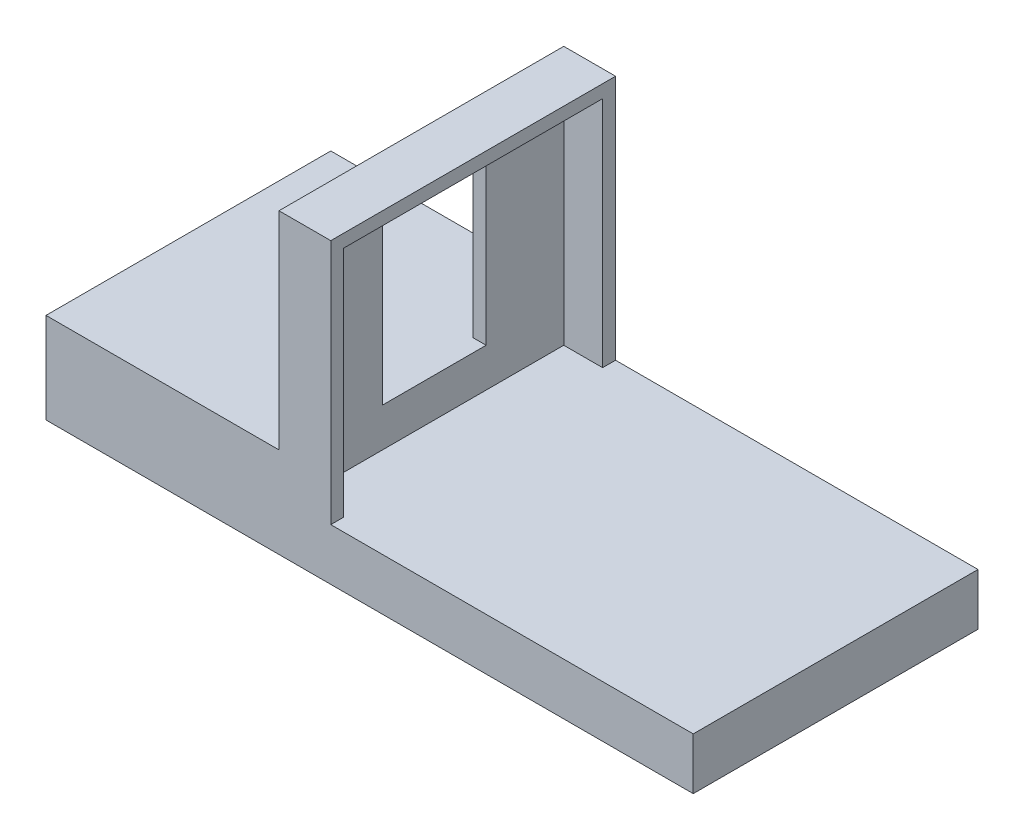
ISO-10303-21;
HEADER;
FILE_DESCRIPTION(('STEP AP214'),'2;1');
FILE_NAME('part.step','',(''),(''),'','','');
FILE_SCHEMA(('AUTOMOTIVE_DESIGN { 1 0 10303 214 1 1 1 1 }'));
ENDSEC;
DATA;
#1=APPLICATION_CONTEXT('core data for automotive mechanical design processes');
#2=APPLICATION_PROTOCOL_DEFINITION('international standard','automotive_design',2000,#1);
#3=PRODUCT_CONTEXT('',#1,'mechanical');
#4=PRODUCT('Part','Part','',(#3));
#5=PRODUCT_RELATED_PRODUCT_CATEGORY('part','',(#4));
#6=PRODUCT_DEFINITION_FORMATION('','',#4);
#7=PRODUCT_DEFINITION_CONTEXT('part definition',#1,'design');
#8=PRODUCT_DEFINITION('design','',#6,#7);
#9=PRODUCT_DEFINITION_SHAPE('','',#8);
#10=(LENGTH_UNIT() NAMED_UNIT(*) SI_UNIT(.MILLI.,.METRE.));
#11=(NAMED_UNIT(*) PLANE_ANGLE_UNIT() SI_UNIT($,.RADIAN.));
#12=(NAMED_UNIT(*) SI_UNIT($,.STERADIAN.) SOLID_ANGLE_UNIT());
#13=UNCERTAINTY_MEASURE_WITH_UNIT(LENGTH_MEASURE(1.E-05),#10,'distance_accuracy_value','');
#14=(GEOMETRIC_REPRESENTATION_CONTEXT(3) GLOBAL_UNCERTAINTY_ASSIGNED_CONTEXT((#13)) GLOBAL_UNIT_ASSIGNED_CONTEXT((#10,
#11,#12)) REPRESENTATION_CONTEXT('',''));
#15=CARTESIAN_POINT('',(0.,0.,0.));
#16=DIRECTION('',(0.,0.,1.));
#17=DIRECTION('',(1.,0.,0.));
#18=AXIS2_PLACEMENT_3D('',#15,#16,#17);
#19=CARTESIAN_POINT('',(-120.,15.,50.));
#20=DIRECTION('',(0.,0.,1.));
#21=DIRECTION('',(1.,0.,0.));
#22=AXIS2_PLACEMENT_3D('',#19,#20,#21);
#23=PLANE('',#22);
#24=DIRECTION('',(-1.,0.,0.));
#25=VECTOR('',#24,1.);
#26=CARTESIAN_POINT('',(-30.,20.,50.));
#27=LINE('',#26,#25);
#28=CARTESIAN_POINT('',(-15.,20.,50.));
#29=VERTEX_POINT('',#28);
#30=CARTESIAN_POINT('',(-30.,20.,50.));
#31=VERTEX_POINT('',#30);
#32=EDGE_CURVE('E55',#29,#31,#27,.T.);
#33=ORIENTED_EDGE('',*,*,#32,.T.);
#34=DIRECTION('',(0.,-1.,0.));
#35=VECTOR('',#34,1.);
#36=CARTESIAN_POINT('',(-30.,110.,50.));
#37=LINE('',#36,#35);
#38=CARTESIAN_POINT('',(-30.,110.,50.));
#39=VERTEX_POINT('',#38);
#40=EDGE_CURVE('E196',#39,#31,#37,.T.);
#41=ORIENTED_EDGE('',*,*,#40,.F.);
#42=DIRECTION('',(-1.,0.,0.));
#43=VECTOR('',#42,1.);
#44=CARTESIAN_POINT('',(-30.,110.,50.));
#45=LINE('',#44,#43);
#46=CARTESIAN_POINT('',(-15.,110.,50.));
#47=VERTEX_POINT('',#46);
#48=EDGE_CURVE('E197',#47,#39,#45,.T.);
#49=ORIENTED_EDGE('',*,*,#48,.F.);
#50=DIRECTION('',(0.,1.,0.));
#51=VECTOR('',#50,1.);
#52=CARTESIAN_POINT('',(-15.,35.,50.));
#53=LINE('',#52,#51);
#54=EDGE_CURVE('E11',#29,#47,#53,.T.);
#55=ORIENTED_EDGE('',*,*,#54,.F.);
#56=EDGE_LOOP('',(#33,#41,#49,#55));
#57=FACE_BOUND('',#56,.T.);
#58=ADVANCED_FACE('F39',(#57),#23,.F.);
#59=CARTESIAN_POINT('',(-120.,15.,-50.));
#60=DIRECTION('',(0.,0.,-1.));
#61=DIRECTION('',(-1.,0.,0.));
#62=AXIS2_PLACEMENT_3D('',#59,#60,#61);
#63=PLANE('',#62);
#64=DIRECTION('',(1.,0.,0.));
#65=VECTOR('',#64,1.);
#66=CARTESIAN_POINT('',(-30.,20.,-50.));
#67=LINE('',#66,#65);
#68=CARTESIAN_POINT('',(-30.,20.,-50.));
#69=VERTEX_POINT('',#68);
#70=CARTESIAN_POINT('',(-15.,20.,-50.));
#71=VERTEX_POINT('',#70);
#72=EDGE_CURVE('E212',#69,#71,#67,.T.);
#73=ORIENTED_EDGE('',*,*,#72,.T.);
#74=DIRECTION('',(0.,-1.,0.));
#75=VECTOR('',#74,1.);
#76=CARTESIAN_POINT('',(-15.,35.,-50.));
#77=LINE('',#76,#75);
#78=CARTESIAN_POINT('',(-15.,110.,-50.));
#79=VERTEX_POINT('',#78);
#80=EDGE_CURVE('E48',#79,#71,#77,.T.);
#81=ORIENTED_EDGE('',*,*,#80,.F.);
#82=DIRECTION('',(1.,0.,0.));
#83=VECTOR('',#82,1.);
#84=CARTESIAN_POINT('',(-30.,110.,-50.));
#85=LINE('',#84,#83);
#86=CARTESIAN_POINT('',(-30.,110.,-50.));
#87=VERTEX_POINT('',#86);
#88=EDGE_CURVE('E200',#87,#79,#85,.T.);
#89=ORIENTED_EDGE('',*,*,#88,.F.);
#90=DIRECTION('',(0.,-1.,0.));
#91=VECTOR('',#90,1.);
#92=CARTESIAN_POINT('',(-30.,110.,-50.));
#93=LINE('',#92,#91);
#94=EDGE_CURVE('E188',#87,#69,#93,.T.);
#95=ORIENTED_EDGE('',*,*,#94,.T.);
#96=EDGE_LOOP('',(#73,#81,#89,#95));
#97=FACE_BOUND('',#96,.T.);
#98=ADVANCED_FACE('F201',(#97),#63,.F.);
#99=CARTESIAN_POINT('',(-30.,110.,50.));
#100=DIRECTION('',(-1.,0.,0.));
#101=DIRECTION('',(0.,0.,1.));
#102=AXIS2_PLACEMENT_3D('',#99,#100,#101);
#103=PLANE('',#102);
#104=DIRECTION('',(0.,0.,1.));
#105=VECTOR('',#104,1.);
#106=CARTESIAN_POINT('',(-30.,35.,0.));
#107=LINE('',#106,#105);
#108=CARTESIAN_POINT('',(-30.,35.,-20.));
#109=VERTEX_POINT('',#108);
#110=CARTESIAN_POINT('',(-30.,35.,20.));
#111=VERTEX_POINT('',#110);
#112=EDGE_CURVE('E232',#109,#111,#107,.T.);
#113=ORIENTED_EDGE('',*,*,#112,.T.);
#114=DIRECTION('',(0.,-1.,0.));
#115=VECTOR('',#114,1.);
#116=CARTESIAN_POINT('',(-30.,100.596067403861,20.));
#117=LINE('',#116,#115);
#118=CARTESIAN_POINT('',(-30.,100.596067403861,20.));
#119=VERTEX_POINT('',#118);
#120=EDGE_CURVE('E219',#119,#111,#117,.T.);
#121=ORIENTED_EDGE('',*,*,#120,.F.);
#122=DIRECTION('',(0.,0.,1.));
#123=VECTOR('',#122,1.);
#124=CARTESIAN_POINT('',(-30.,100.596067403861,-20.));
#125=LINE('',#124,#123);
#126=CARTESIAN_POINT('',(-30.,100.596067403861,-20.));
#127=VERTEX_POINT('',#126);
#128=EDGE_CURVE('E224',#127,#119,#125,.T.);
#129=ORIENTED_EDGE('',*,*,#128,.F.);
#130=DIRECTION('',(0.,1.,0.));
#131=VECTOR('',#130,1.);
#132=CARTESIAN_POINT('',(-30.,100.596067403861,-20.));
#133=LINE('',#132,#131);
#134=EDGE_CURVE('E228',#109,#127,#133,.T.);
#135=ORIENTED_EDGE('',*,*,#134,.F.);
#136=EDGE_LOOP('',(#113,#121,#129,#135));
#137=FACE_BOUND('',#136,.T.);
#138=DIRECTION('',(0.,0.,-1.));
#139=VECTOR('',#138,1.);
#140=CARTESIAN_POINT('',(-30.,20.,50.));
#141=LINE('',#140,#139);
#142=EDGE_CURVE('E62',#31,#69,#141,.T.);
#143=ORIENTED_EDGE('',*,*,#142,.T.);
#144=ORIENTED_EDGE('',*,*,#94,.F.);
#145=DIRECTION('',(0.,0.,-1.));
#146=VECTOR('',#145,1.);
#147=CARTESIAN_POINT('',(-30.,110.,50.));
#148=LINE('',#147,#146);
#149=EDGE_CURVE('E192',#39,#87,#148,.T.);
#150=ORIENTED_EDGE('',*,*,#149,.F.);
#151=ORIENTED_EDGE('',*,*,#40,.T.);
#152=EDGE_LOOP('',(#143,#144,#150,#151));
#153=FACE_BOUND('',#152,.T.);
#154=ADVANCED_FACE('F190',(#137,#153),#103,.F.);
#155=CARTESIAN_POINT('',(0.,15.,0.));
#156=DIRECTION('',(0.,-1.,0.));
#157=DIRECTION('',(0.,0.,-1.));
#158=AXIS2_PLACEMENT_3D('',#155,#156,#157);
#159=PLANE('',#158);
#160=DIRECTION('',(-1.,0.,0.));
#161=VECTOR('',#160,1.);
#162=CARTESIAN_POINT('',(-120.,15.,50.));
#163=LINE('',#162,#161);
#164=CARTESIAN_POINT('',(120.,15.,50.));
#165=VERTEX_POINT('',#164);
#166=CARTESIAN_POINT('',(-35.,15.,50.));
#167=VERTEX_POINT('',#166);
#168=EDGE_CURVE('E269',#165,#167,#163,.T.);
#169=ORIENTED_EDGE('',*,*,#168,.T.);
#170=DIRECTION('',(0.,0.,-1.));
#171=VECTOR('',#170,1.);
#172=CARTESIAN_POINT('',(-35.,15.,50.));
#173=LINE('',#172,#171);
#174=CARTESIAN_POINT('',(-35.,15.,-50.));
#175=VERTEX_POINT('',#174);
#176=EDGE_CURVE('E235',#167,#175,#173,.T.);
#177=ORIENTED_EDGE('',*,*,#176,.T.);
#178=DIRECTION('',(1.,0.,0.));
#179=VECTOR('',#178,1.);
#180=CARTESIAN_POINT('',(-120.,15.,-50.));
#181=LINE('',#180,#179);
#182=CARTESIAN_POINT('',(120.,15.,-50.));
#183=VERTEX_POINT('',#182);
#184=EDGE_CURVE('E261',#175,#183,#181,.T.);
#185=ORIENTED_EDGE('',*,*,#184,.T.);
#186=DIRECTION('',(0.,0.,1.));
#187=VECTOR('',#186,1.);
#188=CARTESIAN_POINT('',(120.,15.,50.));
#189=LINE('',#188,#187);
#190=EDGE_CURVE('E264',#183,#165,#189,.T.);
#191=ORIENTED_EDGE('',*,*,#190,.T.);
#192=EDGE_LOOP('',(#169,#177,#185,#191));
#193=FACE_BOUND('',#192,.T.);
#194=ADVANCED_FACE('F461',(#193),#159,.T.);
#195=CARTESIAN_POINT('',(-125.,20.,-55.));
#196=DIRECTION('',(1.,0.,0.));
#197=DIRECTION('',(0.,0.,-1.));
#198=AXIS2_PLACEMENT_3D('',#195,#196,#197);
#199=PLANE('',#198);
#200=DIRECTION('',(0.,0.,1.));
#201=VECTOR('',#200,1.);
#202=CARTESIAN_POINT('',(-125.,0.,-55.));
#203=LINE('',#202,#201);
#204=CARTESIAN_POINT('',(-125.,0.,-55.));
#205=VERTEX_POINT('',#204);
#206=CARTESIAN_POINT('',(-125.,0.,55.));
#207=VERTEX_POINT('',#206);
#208=EDGE_CURVE('E373',#205,#207,#203,.T.);
#209=ORIENTED_EDGE('',*,*,#208,.T.);
#210=DIRECTION('',(0.,-1.,0.));
#211=VECTOR('',#210,1.);
#212=CARTESIAN_POINT('',(-125.,20.,55.));
#213=LINE('',#212,#211);
#214=CARTESIAN_POINT('',(-125.,35.,55.));
#215=VERTEX_POINT('',#214);
#216=EDGE_CURVE('E408',#215,#207,#213,.T.);
#217=ORIENTED_EDGE('',*,*,#216,.F.);
#218=DIRECTION('',(0.,0.,1.));
#219=VECTOR('',#218,1.);
#220=CARTESIAN_POINT('',(-125.,35.,-55.));
#221=LINE('',#220,#219);
#222=CARTESIAN_POINT('',(-125.,35.,-55.));
#223=VERTEX_POINT('',#222);
#224=EDGE_CURVE('E350',#223,#215,#221,.T.);
#225=ORIENTED_EDGE('',*,*,#224,.F.);
#226=DIRECTION('',(0.,-1.,0.));
#227=VECTOR('',#226,1.);
#228=CARTESIAN_POINT('',(-125.,20.,-55.));
#229=LINE('',#228,#227);
#230=EDGE_CURVE('E385',#223,#205,#229,.T.);
#231=ORIENTED_EDGE('',*,*,#230,.T.);
#232=EDGE_LOOP('',(#209,#217,#225,#231));
#233=FACE_BOUND('',#232,.T.);
#234=ADVANCED_FACE('F41',(#233),#199,.F.);
#235=CARTESIAN_POINT('',(-125.,20.,55.));
#236=DIRECTION('',(0.,0.,-1.));
#237=DIRECTION('',(-1.,0.,0.));
#238=AXIS2_PLACEMENT_3D('',#235,#236,#237);
#239=PLANE('',#238);
#240=DIRECTION('',(1.,0.,0.));
#241=VECTOR('',#240,1.);
#242=CARTESIAN_POINT('',(-125.,0.,55.));
#243=LINE('',#242,#241);
#244=CARTESIAN_POINT('',(125.,0.,55.));
#245=VERTEX_POINT('',#244);
#246=EDGE_CURVE('E389',#207,#245,#243,.T.);
#247=ORIENTED_EDGE('',*,*,#246,.T.);
#248=DIRECTION('',(0.,-1.,0.));
#249=VECTOR('',#248,1.);
#250=CARTESIAN_POINT('',(125.,20.,55.));
#251=LINE('',#250,#249);
#252=CARTESIAN_POINT('',(125.,20.,55.));
#253=VERTEX_POINT('',#252);
#254=EDGE_CURVE('E404',#253,#245,#251,.T.);
#255=ORIENTED_EDGE('',*,*,#254,.F.);
#256=DIRECTION('',(1.,0.,0.));
#257=VECTOR('',#256,1.);
#258=CARTESIAN_POINT('',(-125.,20.,55.));
#259=LINE('',#258,#257);
#260=CARTESIAN_POINT('',(-15.,20.,55.));
#261=VERTEX_POINT('',#260);
#262=EDGE_CURVE('E374',#261,#253,#259,.T.);
#263=ORIENTED_EDGE('',*,*,#262,.F.);
#264=DIRECTION('',(0.,-1.,0.));
#265=VECTOR('',#264,1.);
#266=CARTESIAN_POINT('',(-15.,35.,55.));
#267=LINE('',#266,#265);
#268=CARTESIAN_POINT('',(-15.,115.,55.));
#269=VERTEX_POINT('',#268);
#270=EDGE_CURVE('E369',#269,#261,#267,.T.);
#271=ORIENTED_EDGE('',*,*,#270,.F.);
#272=DIRECTION('',(1.,0.,0.));
#273=VECTOR('',#272,1.);
#274=CARTESIAN_POINT('',(-15.,115.,55.));
#275=LINE('',#274,#273);
#276=CARTESIAN_POINT('',(-35.,115.,55.));
#277=VERTEX_POINT('',#276);
#278=EDGE_CURVE('E334',#277,#269,#275,.T.);
#279=ORIENTED_EDGE('',*,*,#278,.F.);
#280=DIRECTION('',(0.,-1.,0.));
#281=VECTOR('',#280,1.);
#282=CARTESIAN_POINT('',(-35.,115.,55.));
#283=LINE('',#282,#281);
#284=CARTESIAN_POINT('',(-35.,35.,55.));
#285=VERTEX_POINT('',#284);
#286=EDGE_CURVE('E338',#277,#285,#283,.T.);
#287=ORIENTED_EDGE('',*,*,#286,.T.);
#288=DIRECTION('',(1.,0.,0.));
#289=VECTOR('',#288,1.);
#290=CARTESIAN_POINT('',(-125.,35.,55.));
#291=LINE('',#290,#289);
#292=EDGE_CURVE('E354',#215,#285,#291,.T.);
#293=ORIENTED_EDGE('',*,*,#292,.F.);
#294=ORIENTED_EDGE('',*,*,#216,.T.);
#295=EDGE_LOOP('',(#247,#255,#263,#271,#279,#287,#293,#294));
#296=FACE_BOUND('',#295,.T.);
#297=ADVANCED_FACE('F438',(#296),#239,.F.);
#298=CARTESIAN_POINT('',(125.,20.,-55.));
#299=DIRECTION('',(-1.,0.,0.));
#300=DIRECTION('',(0.,0.,1.));
#301=AXIS2_PLACEMENT_3D('',#298,#299,#300);
#302=PLANE('',#301);
#303=DIRECTION('',(0.,0.,-1.));
#304=VECTOR('',#303,1.);
#305=CARTESIAN_POINT('',(125.,0.,-55.));
#306=LINE('',#305,#304);
#307=CARTESIAN_POINT('',(125.,0.,-55.));
#308=VERTEX_POINT('',#307);
#309=EDGE_CURVE('E392',#245,#308,#306,.T.);
#310=ORIENTED_EDGE('',*,*,#309,.T.);
#311=DIRECTION('',(0.,-1.,0.));
#312=VECTOR('',#311,1.);
#313=CARTESIAN_POINT('',(125.,20.,-55.));
#314=LINE('',#313,#312);
#315=CARTESIAN_POINT('',(125.,20.,-55.));
#316=VERTEX_POINT('',#315);
#317=EDGE_CURVE('E400',#316,#308,#314,.T.);
#318=ORIENTED_EDGE('',*,*,#317,.F.);
#319=DIRECTION('',(0.,0.,-1.));
#320=VECTOR('',#319,1.);
#321=CARTESIAN_POINT('',(125.,20.,-55.));
#322=LINE('',#321,#320);
#323=EDGE_CURVE('E377',#253,#316,#322,.T.);
#324=ORIENTED_EDGE('',*,*,#323,.F.);
#325=ORIENTED_EDGE('',*,*,#254,.T.);
#326=EDGE_LOOP('',(#310,#318,#324,#325));
#327=FACE_BOUND('',#326,.T.);
#328=ADVANCED_FACE('F545',(#327),#302,.F.);
#329=CARTESIAN_POINT('',(-125.,20.,-55.));
#330=DIRECTION('',(0.,0.,1.));
#331=DIRECTION('',(1.,0.,0.));
#332=AXIS2_PLACEMENT_3D('',#329,#330,#331);
#333=PLANE('',#332);
#334=DIRECTION('',(-1.,0.,0.));
#335=VECTOR('',#334,1.);
#336=CARTESIAN_POINT('',(-125.,0.,-55.));
#337=LINE('',#336,#335);
#338=EDGE_CURVE('E378',#308,#205,#337,.T.);
#339=ORIENTED_EDGE('',*,*,#338,.T.);
#340=ORIENTED_EDGE('',*,*,#230,.F.);
#341=DIRECTION('',(-1.,0.,0.));
#342=VECTOR('',#341,1.);
#343=CARTESIAN_POINT('',(-125.,35.,-55.));
#344=LINE('',#343,#342);
#345=CARTESIAN_POINT('',(-35.,35.,-55.));
#346=VERTEX_POINT('',#345);
#347=EDGE_CURVE('E359',#346,#223,#344,.T.);
#348=ORIENTED_EDGE('',*,*,#347,.F.);
#349=DIRECTION('',(0.,-1.,0.));
#350=VECTOR('',#349,1.);
#351=CARTESIAN_POINT('',(-35.,115.,-55.));
#352=LINE('',#351,#350);
#353=CARTESIAN_POINT('',(-35.,115.,-55.));
#354=VERTEX_POINT('',#353);
#355=EDGE_CURVE('E345',#354,#346,#352,.T.);
#356=ORIENTED_EDGE('',*,*,#355,.F.);
#357=DIRECTION('',(-1.,0.,0.));
#358=VECTOR('',#357,1.);
#359=CARTESIAN_POINT('',(-15.,115.,-55.));
#360=LINE('',#359,#358);
#361=CARTESIAN_POINT('',(-15.,115.,-55.));
#362=VERTEX_POINT('',#361);
#363=EDGE_CURVE('E327',#362,#354,#360,.T.);
#364=ORIENTED_EDGE('',*,*,#363,.F.);
#365=DIRECTION('',(0.,-1.,0.));
#366=VECTOR('',#365,1.);
#367=CARTESIAN_POINT('',(-15.,35.,-55.));
#368=LINE('',#367,#366);
#369=CARTESIAN_POINT('',(-15.,20.,-55.));
#370=VERTEX_POINT('',#369);
#371=EDGE_CURVE('E362',#362,#370,#368,.T.);
#372=ORIENTED_EDGE('',*,*,#371,.T.);
#373=DIRECTION('',(-1.,0.,0.));
#374=VECTOR('',#373,1.);
#375=CARTESIAN_POINT('',(-125.,20.,-55.));
#376=LINE('',#375,#374);
#377=EDGE_CURVE('E381',#316,#370,#376,.T.);
#378=ORIENTED_EDGE('',*,*,#377,.F.);
#379=ORIENTED_EDGE('',*,*,#317,.T.);
#380=EDGE_LOOP('',(#339,#340,#348,#356,#364,#372,#378,#379));
#381=FACE_BOUND('',#380,.T.);
#382=ADVANCED_FACE('F446',(#381),#333,.F.);
#383=CARTESIAN_POINT('',(0.,20.,0.));
#384=DIRECTION('',(0.,1.,0.));
#385=DIRECTION('',(0.,0.,1.));
#386=AXIS2_PLACEMENT_3D('',#383,#384,#385);
#387=PLANE('',#386);
#388=DIRECTION('',(0.,0.,-1.));
#389=VECTOR('',#388,1.);
#390=CARTESIAN_POINT('',(-15.,20.,-55.));
#391=LINE('',#390,#389);
#392=EDGE_CURVE('E349',#71,#370,#391,.T.);
#393=ORIENTED_EDGE('',*,*,#392,.F.);
#394=ORIENTED_EDGE('',*,*,#72,.F.);
#395=ORIENTED_EDGE('',*,*,#142,.F.);
#396=ORIENTED_EDGE('',*,*,#32,.F.);
#397=EDGE_CURVE('E355',#261,#29,#391,.T.);
#398=ORIENTED_EDGE('',*,*,#397,.F.);
#399=ORIENTED_EDGE('',*,*,#262,.T.);
#400=ORIENTED_EDGE('',*,*,#323,.T.);
#401=ORIENTED_EDGE('',*,*,#377,.T.);
#402=EDGE_LOOP('',(#393,#394,#395,#396,#398,#399,#400,#401));
#403=FACE_BOUND('',#402,.T.);
#404=ADVANCED_FACE('F419',(#403),#387,.T.);
#405=CARTESIAN_POINT('',(0.,0.,0.));
#406=DIRECTION('',(0.,1.,0.));
#407=DIRECTION('',(0.,0.,1.));
#408=AXIS2_PLACEMENT_3D('',#405,#406,#407);
#409=PLANE('',#408);
#410=DIRECTION('',(1.,0.,0.));
#411=VECTOR('',#410,1.);
#412=CARTESIAN_POINT('',(-120.,0.,-50.));
#413=LINE('',#412,#411);
#414=CARTESIAN_POINT('',(-120.,0.,-50.));
#415=VERTEX_POINT('',#414);
#416=CARTESIAN_POINT('',(120.,0.,-50.));
#417=VERTEX_POINT('',#416);
#418=EDGE_CURVE('E275',#415,#417,#413,.T.);
#419=ORIENTED_EDGE('',*,*,#418,.F.);
#420=DIRECTION('',(0.,0.,-1.));
#421=VECTOR('',#420,1.);
#422=CARTESIAN_POINT('',(-120.,0.,50.));
#423=LINE('',#422,#421);
#424=CARTESIAN_POINT('',(-120.,0.,50.));
#425=VERTEX_POINT('',#424);
#426=EDGE_CURVE('E258',#425,#415,#423,.T.);
#427=ORIENTED_EDGE('',*,*,#426,.F.);
#428=DIRECTION('',(-1.,0.,0.));
#429=VECTOR('',#428,1.);
#430=CARTESIAN_POINT('',(-120.,0.,50.));
#431=LINE('',#430,#429);
#432=CARTESIAN_POINT('',(120.,0.,50.));
#433=VERTEX_POINT('',#432);
#434=EDGE_CURVE('E265',#433,#425,#431,.T.);
#435=ORIENTED_EDGE('',*,*,#434,.F.);
#436=DIRECTION('',(0.,0.,1.));
#437=VECTOR('',#436,1.);
#438=CARTESIAN_POINT('',(120.,0.,50.));
#439=LINE('',#438,#437);
#440=EDGE_CURVE('E279',#417,#433,#439,.T.);
#441=ORIENTED_EDGE('',*,*,#440,.F.);
#442=EDGE_LOOP('',(#419,#427,#435,#441));
#443=FACE_BOUND('',#442,.T.);
#444=ORIENTED_EDGE('',*,*,#208,.F.);
#445=ORIENTED_EDGE('',*,*,#338,.F.);
#446=ORIENTED_EDGE('',*,*,#309,.F.);
#447=ORIENTED_EDGE('',*,*,#246,.F.);
#448=EDGE_LOOP('',(#444,#445,#446,#447));
#449=FACE_BOUND('',#448,.T.);
#450=ADVANCED_FACE('F508',(#443,#449),#409,.F.);
#451=CARTESIAN_POINT('',(-15.,35.,-55.));
#452=DIRECTION('',(-1.,0.,0.));
#453=DIRECTION('',(0.,0.,1.));
#454=AXIS2_PLACEMENT_3D('',#451,#452,#453);
#455=PLANE('',#454);
#456=ORIENTED_EDGE('',*,*,#397,.T.);
#457=ORIENTED_EDGE('',*,*,#54,.T.);
#458=DIRECTION('',(0.,0.,1.));
#459=VECTOR('',#458,1.);
#460=CARTESIAN_POINT('',(-15.,110.,-55.));
#461=LINE('',#460,#459);
#462=EDGE_CURVE('E412',#79,#47,#461,.T.);
#463=ORIENTED_EDGE('',*,*,#462,.F.);
#464=ORIENTED_EDGE('',*,*,#80,.T.);
#465=ORIENTED_EDGE('',*,*,#392,.T.);
#466=ORIENTED_EDGE('',*,*,#371,.F.);
#467=DIRECTION('',(0.,0.,-1.));
#468=VECTOR('',#467,1.);
#469=CARTESIAN_POINT('',(-15.,115.,-55.));
#470=LINE('',#469,#468);
#471=EDGE_CURVE('E323',#269,#362,#470,.T.);
#472=ORIENTED_EDGE('',*,*,#471,.F.);
#473=ORIENTED_EDGE('',*,*,#270,.T.);
#474=EDGE_LOOP('',(#456,#457,#463,#464,#465,#466,#472,#473));
#475=FACE_BOUND('',#474,.T.);
#476=ADVANCED_FACE('F417',(#475),#455,.F.);
#477=CARTESIAN_POINT('',(0.,35.,0.));
#478=DIRECTION('',(0.,1.,0.));
#479=DIRECTION('',(0.,0.,1.));
#480=AXIS2_PLACEMENT_3D('',#477,#478,#479);
#481=PLANE('',#480);
#482=ORIENTED_EDGE('',*,*,#112,.F.);
#483=DIRECTION('',(-1.,0.,0.));
#484=VECTOR('',#483,1.);
#485=CARTESIAN_POINT('',(45.,35.,-20.));
#486=LINE('',#485,#484);
#487=CARTESIAN_POINT('',(-35.,35.,-20.));
#488=VERTEX_POINT('',#487);
#489=EDGE_CURVE('E310',#109,#488,#486,.T.);
#490=ORIENTED_EDGE('',*,*,#489,.T.);
#491=DIRECTION('',(0.,0.,1.));
#492=VECTOR('',#491,1.);
#493=CARTESIAN_POINT('',(-35.,35.,-55.));
#494=LINE('',#493,#492);
#495=EDGE_CURVE('E328',#346,#488,#494,.T.);
#496=ORIENTED_EDGE('',*,*,#495,.F.);
#497=ORIENTED_EDGE('',*,*,#347,.T.);
#498=ORIENTED_EDGE('',*,*,#224,.T.);
#499=ORIENTED_EDGE('',*,*,#292,.T.);
#500=CARTESIAN_POINT('',(-35.,35.,20.));
#501=VERTEX_POINT('',#500);
#502=EDGE_CURVE('E314',#501,#285,#494,.T.);
#503=ORIENTED_EDGE('',*,*,#502,.F.);
#504=DIRECTION('',(-1.,0.,0.));
#505=VECTOR('',#504,1.);
#506=CARTESIAN_POINT('',(45.,35.,20.));
#507=LINE('',#506,#505);
#508=EDGE_CURVE('E318',#111,#501,#507,.T.);
#509=ORIENTED_EDGE('',*,*,#508,.F.);
#510=EDGE_LOOP('',(#482,#490,#496,#497,#498,#499,#503,#509));
#511=FACE_BOUND('',#510,.T.);
#512=ADVANCED_FACE('F435',(#511),#481,.T.);
#513=CARTESIAN_POINT('',(-35.,115.,-55.));
#514=DIRECTION('',(1.,0.,0.));
#515=DIRECTION('',(0.,0.,-1.));
#516=AXIS2_PLACEMENT_3D('',#513,#514,#515);
#517=PLANE('',#516);
#518=ORIENTED_EDGE('',*,*,#495,.T.);
#519=DIRECTION('',(0.,-1.,0.));
#520=VECTOR('',#519,1.);
#521=CARTESIAN_POINT('',(-35.,100.596067403861,-20.));
#522=LINE('',#521,#520);
#523=CARTESIAN_POINT('',(-35.,100.596067403861,-20.));
#524=VERTEX_POINT('',#523);
#525=EDGE_CURVE('E289',#524,#488,#522,.T.);
#526=ORIENTED_EDGE('',*,*,#525,.F.);
#527=DIRECTION('',(0.,0.,-1.));
#528=VECTOR('',#527,1.);
#529=CARTESIAN_POINT('',(-35.,100.596067403861,-20.));
#530=LINE('',#529,#528);
#531=CARTESIAN_POINT('',(-35.,100.596067403861,20.));
#532=VERTEX_POINT('',#531);
#533=EDGE_CURVE('E306',#532,#524,#530,.T.);
#534=ORIENTED_EDGE('',*,*,#533,.F.);
#535=DIRECTION('',(0.,1.,0.));
#536=VECTOR('',#535,1.);
#537=CARTESIAN_POINT('',(-35.,100.596067403861,20.));
#538=LINE('',#537,#536);
#539=EDGE_CURVE('E302',#501,#532,#538,.T.);
#540=ORIENTED_EDGE('',*,*,#539,.F.);
#541=ORIENTED_EDGE('',*,*,#502,.T.);
#542=ORIENTED_EDGE('',*,*,#286,.F.);
#543=DIRECTION('',(0.,0.,1.));
#544=VECTOR('',#543,1.);
#545=CARTESIAN_POINT('',(-35.,115.,-55.));
#546=LINE('',#545,#544);
#547=EDGE_CURVE('E331',#354,#277,#546,.T.);
#548=ORIENTED_EDGE('',*,*,#547,.F.);
#549=ORIENTED_EDGE('',*,*,#355,.T.);
#550=EDGE_LOOP('',(#518,#526,#534,#540,#541,#542,#548,#549));
#551=FACE_BOUND('',#550,.T.);
#552=ADVANCED_FACE('F427',(#551),#517,.F.);
#553=CARTESIAN_POINT('',(0.,115.,0.));
#554=DIRECTION('',(0.,-1.,0.));
#555=DIRECTION('',(0.,0.,-1.));
#556=AXIS2_PLACEMENT_3D('',#553,#554,#555);
#557=PLANE('',#556);
#558=ORIENTED_EDGE('',*,*,#471,.T.);
#559=ORIENTED_EDGE('',*,*,#363,.T.);
#560=ORIENTED_EDGE('',*,*,#547,.T.);
#561=ORIENTED_EDGE('',*,*,#278,.T.);
#562=EDGE_LOOP('',(#558,#559,#560,#561));
#563=FACE_BOUND('',#562,.T.);
#564=ADVANCED_FACE('F442',(#563),#557,.F.);
#565=CARTESIAN_POINT('',(45.,100.596067403861,-20.));
#566=DIRECTION('',(0.,0.,-1.));
#567=DIRECTION('',(-1.,0.,0.));
#568=AXIS2_PLACEMENT_3D('',#565,#566,#567);
#569=PLANE('',#568);
#570=ORIENTED_EDGE('',*,*,#489,.F.);
#571=ORIENTED_EDGE('',*,*,#134,.T.);
#572=DIRECTION('',(-1.,0.,0.));
#573=VECTOR('',#572,1.);
#574=CARTESIAN_POINT('',(45.,100.596067403861,-20.));
#575=LINE('',#574,#573);
#576=EDGE_CURVE('E311',#127,#524,#575,.T.);
#577=ORIENTED_EDGE('',*,*,#576,.T.);
#578=ORIENTED_EDGE('',*,*,#525,.T.);
#579=EDGE_LOOP('',(#570,#571,#577,#578));
#580=FACE_BOUND('',#579,.T.);
#581=ADVANCED_FACE('F452',(#580),#569,.F.);
#582=CARTESIAN_POINT('',(45.,100.596067403861,-20.));
#583=DIRECTION('',(0.,1.,0.));
#584=DIRECTION('',(0.,0.,1.));
#585=AXIS2_PLACEMENT_3D('',#582,#583,#584);
#586=PLANE('',#585);
#587=ORIENTED_EDGE('',*,*,#576,.F.);
#588=ORIENTED_EDGE('',*,*,#128,.T.);
#589=DIRECTION('',(-1.,0.,0.));
#590=VECTOR('',#589,1.);
#591=CARTESIAN_POINT('',(45.,100.596067403861,20.));
#592=LINE('',#591,#590);
#593=EDGE_CURVE('E315',#119,#532,#592,.T.);
#594=ORIENTED_EDGE('',*,*,#593,.T.);
#595=ORIENTED_EDGE('',*,*,#533,.T.);
#596=EDGE_LOOP('',(#587,#588,#594,#595));
#597=FACE_BOUND('',#596,.T.);
#598=ADVANCED_FACE('F455',(#597),#586,.F.);
#599=CARTESIAN_POINT('',(45.,100.596067403861,20.));
#600=DIRECTION('',(0.,0.,1.));
#601=DIRECTION('',(0.,-1.,0.));
#602=AXIS2_PLACEMENT_3D('',#599,#600,#601);
#603=PLANE('',#602);
#604=ORIENTED_EDGE('',*,*,#593,.F.);
#605=ORIENTED_EDGE('',*,*,#120,.T.);
#606=ORIENTED_EDGE('',*,*,#508,.T.);
#607=ORIENTED_EDGE('',*,*,#539,.T.);
#608=EDGE_LOOP('',(#604,#605,#606,#607));
#609=FACE_BOUND('',#608,.T.);
#610=ADVANCED_FACE('F458',(#609),#603,.F.);
#611=CARTESIAN_POINT('',(-120.,15.,50.));
#612=DIRECTION('',(-1.,0.,0.));
#613=DIRECTION('',(0.,0.,1.));
#614=AXIS2_PLACEMENT_3D('',#611,#612,#613);
#615=PLANE('',#614);
#616=ORIENTED_EDGE('',*,*,#426,.T.);
#617=DIRECTION('',(0.,-1.,0.));
#618=VECTOR('',#617,1.);
#619=CARTESIAN_POINT('',(-120.,15.,-50.));
#620=LINE('',#619,#618);
#621=CARTESIAN_POINT('',(-120.,30.,-50.));
#622=VERTEX_POINT('',#621);
#623=EDGE_CURVE('E272',#622,#415,#620,.T.);
#624=ORIENTED_EDGE('',*,*,#623,.F.);
#625=DIRECTION('',(0.,0.,-1.));
#626=VECTOR('',#625,1.);
#627=CARTESIAN_POINT('',(-120.,30.,50.));
#628=LINE('',#627,#626);
#629=CARTESIAN_POINT('',(-120.,30.,50.));
#630=VERTEX_POINT('',#629);
#631=EDGE_CURVE('E246',#630,#622,#628,.T.);
#632=ORIENTED_EDGE('',*,*,#631,.F.);
#633=DIRECTION('',(0.,-1.,0.));
#634=VECTOR('',#633,1.);
#635=CARTESIAN_POINT('',(-120.,15.,50.));
#636=LINE('',#635,#634);
#637=EDGE_CURVE('E286',#630,#425,#636,.T.);
#638=ORIENTED_EDGE('',*,*,#637,.T.);
#639=EDGE_LOOP('',(#616,#624,#632,#638));
#640=FACE_BOUND('',#639,.T.);
#641=ADVANCED_FACE('F481',(#640),#615,.F.);
#642=DIRECTION('',(0.,-1.,0.));
#643=VECTOR('',#642,1.);
#644=CARTESIAN_POINT('',(-35.,30.,50.));
#645=LINE('',#644,#643);
#646=CARTESIAN_POINT('',(-35.,30.,50.));
#647=VERTEX_POINT('',#646);
#648=EDGE_CURVE('E254',#647,#167,#645,.T.);
#649=ORIENTED_EDGE('',*,*,#648,.T.);
#650=ORIENTED_EDGE('',*,*,#168,.F.);
#651=DIRECTION('',(0.,-1.,0.));
#652=VECTOR('',#651,1.);
#653=CARTESIAN_POINT('',(120.,15.,50.));
#654=LINE('',#653,#652);
#655=EDGE_CURVE('E290',#165,#433,#654,.T.);
#656=ORIENTED_EDGE('',*,*,#655,.T.);
#657=ORIENTED_EDGE('',*,*,#434,.T.);
#658=ORIENTED_EDGE('',*,*,#637,.F.);
#659=DIRECTION('',(1.,0.,0.));
#660=VECTOR('',#659,1.);
#661=CARTESIAN_POINT('',(-120.,30.,50.));
#662=LINE('',#661,#660);
#663=EDGE_CURVE('E243',#630,#647,#662,.T.);
#664=ORIENTED_EDGE('',*,*,#663,.T.);
#665=EDGE_LOOP('',(#649,#650,#656,#657,#658,#664));
#666=FACE_BOUND('',#665,.T.);
#667=ADVANCED_FACE('F475',(#666),#23,.F.);
#668=CARTESIAN_POINT('',(120.,15.,50.));
#669=DIRECTION('',(1.,0.,0.));
#670=DIRECTION('',(0.,0.,-1.));
#671=AXIS2_PLACEMENT_3D('',#668,#669,#670);
#672=PLANE('',#671);
#673=ORIENTED_EDGE('',*,*,#440,.T.);
#674=ORIENTED_EDGE('',*,*,#655,.F.);
#675=ORIENTED_EDGE('',*,*,#190,.F.);
#676=DIRECTION('',(0.,-1.,0.));
#677=VECTOR('',#676,1.);
#678=CARTESIAN_POINT('',(120.,15.,-50.));
#679=LINE('',#678,#677);
#680=EDGE_CURVE('E293',#183,#417,#679,.T.);
#681=ORIENTED_EDGE('',*,*,#680,.T.);
#682=EDGE_LOOP('',(#673,#674,#675,#681));
#683=FACE_BOUND('',#682,.T.);
#684=ADVANCED_FACE('F480',(#683),#672,.F.);
#685=ORIENTED_EDGE('',*,*,#680,.F.);
#686=ORIENTED_EDGE('',*,*,#184,.F.);
#687=DIRECTION('',(0.,-1.,0.));
#688=VECTOR('',#687,1.);
#689=CARTESIAN_POINT('',(-35.,30.,-50.));
#690=LINE('',#689,#688);
#691=CARTESIAN_POINT('',(-35.,30.,-50.));
#692=VERTEX_POINT('',#691);
#693=EDGE_CURVE('E250',#692,#175,#690,.T.);
#694=ORIENTED_EDGE('',*,*,#693,.F.);
#695=DIRECTION('',(1.,0.,0.));
#696=VECTOR('',#695,1.);
#697=CARTESIAN_POINT('',(-120.,30.,-50.));
#698=LINE('',#697,#696);
#699=EDGE_CURVE('E236',#622,#692,#698,.T.);
#700=ORIENTED_EDGE('',*,*,#699,.F.);
#701=ORIENTED_EDGE('',*,*,#623,.T.);
#702=ORIENTED_EDGE('',*,*,#418,.T.);
#703=EDGE_LOOP('',(#685,#686,#694,#700,#701,#702));
#704=FACE_BOUND('',#703,.T.);
#705=ADVANCED_FACE('F470',(#704),#63,.F.);
#706=CARTESIAN_POINT('',(-35.,30.,50.));
#707=DIRECTION('',(-1.,0.,0.));
#708=DIRECTION('',(0.,0.,1.));
#709=AXIS2_PLACEMENT_3D('',#706,#707,#708);
#710=PLANE('',#709);
#711=ORIENTED_EDGE('',*,*,#176,.F.);
#712=ORIENTED_EDGE('',*,*,#648,.F.);
#713=DIRECTION('',(0.,0.,-1.));
#714=VECTOR('',#713,1.);
#715=CARTESIAN_POINT('',(-35.,30.,50.));
#716=LINE('',#715,#714);
#717=EDGE_CURVE('E240',#647,#692,#716,.T.);
#718=ORIENTED_EDGE('',*,*,#717,.T.);
#719=ORIENTED_EDGE('',*,*,#693,.T.);
#720=EDGE_LOOP('',(#711,#712,#718,#719));
#721=FACE_BOUND('',#720,.T.);
#722=ADVANCED_FACE('F496',(#721),#710,.T.);
#723=CARTESIAN_POINT('',(0.,30.,0.));
#724=DIRECTION('',(0.,1.,0.));
#725=DIRECTION('',(0.,0.,1.));
#726=AXIS2_PLACEMENT_3D('',#723,#724,#725);
#727=PLANE('',#726);
#728=ORIENTED_EDGE('',*,*,#699,.T.);
#729=ORIENTED_EDGE('',*,*,#717,.F.);
#730=ORIENTED_EDGE('',*,*,#663,.F.);
#731=ORIENTED_EDGE('',*,*,#631,.T.);
#732=EDGE_LOOP('',(#728,#729,#730,#731));
#733=FACE_BOUND('',#732,.T.);
#734=ADVANCED_FACE('F512',(#733),#727,.F.);
#735=CARTESIAN_POINT('',(0.,110.,0.));
#736=DIRECTION('',(0.,-1.,0.));
#737=DIRECTION('',(0.,0.,-1.));
#738=AXIS2_PLACEMENT_3D('',#735,#736,#737);
#739=PLANE('',#738);
#740=ORIENTED_EDGE('',*,*,#462,.T.);
#741=ORIENTED_EDGE('',*,*,#48,.T.);
#742=ORIENTED_EDGE('',*,*,#149,.T.);
#743=ORIENTED_EDGE('',*,*,#88,.T.);
#744=EDGE_LOOP('',(#740,#741,#742,#743));
#745=FACE_BOUND('',#744,.T.);
#746=ADVANCED_FACE('F207',(#745),#739,.T.);
#747=CLOSED_SHELL('',(#58,#98,#154,#194,#234,#297,#328,#382,#404,#450,#476,#512,#552,#564,#581,
#598,#610,#641,#667,#684,#705,#722,#734,#746));
#748=MANIFOLD_SOLID_BREP('B2',#747);
#749=ADVANCED_BREP_SHAPE_REPRESENTATION('',(#18,#748),#14);
#750=SHAPE_DEFINITION_REPRESENTATION(#9,#749);
ENDSEC;
END-ISO-10303-21;
